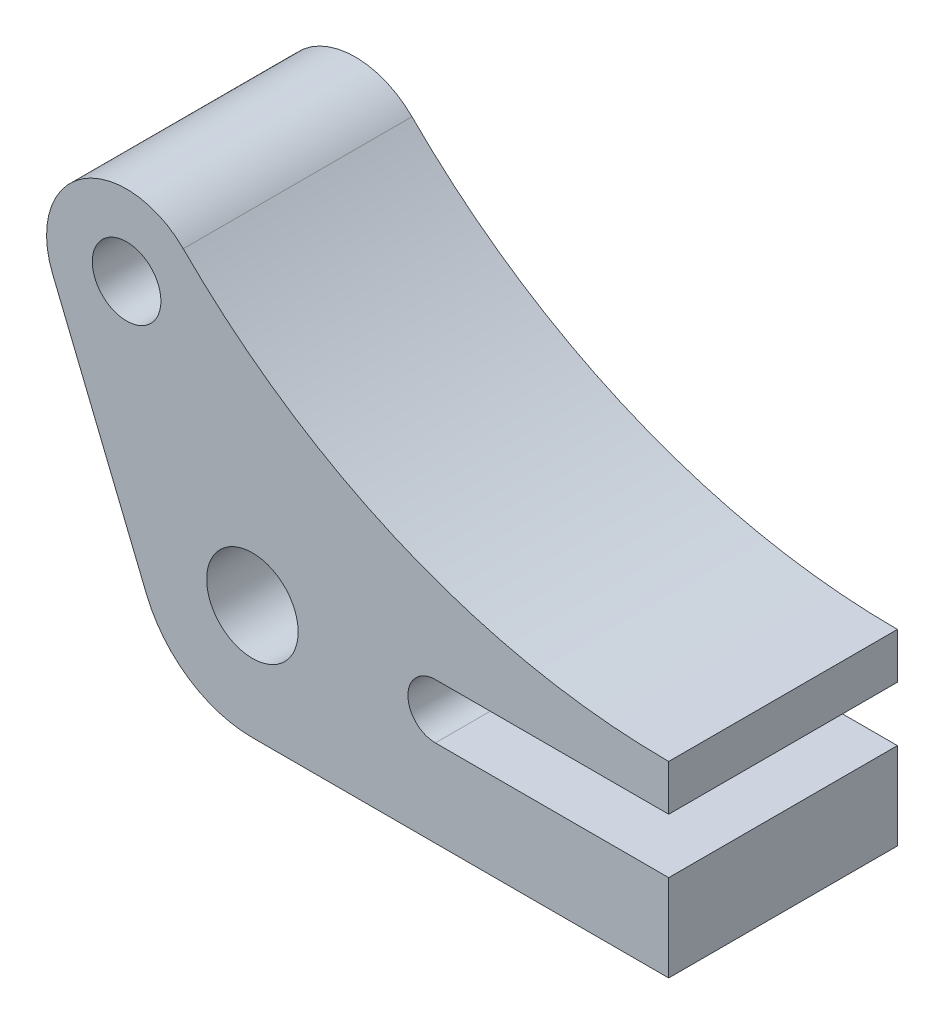
ISO-10303-21;
HEADER;
FILE_DESCRIPTION(('STEP AP214'),'2;1');
FILE_NAME('part.step','',(''),(''),'','','');
FILE_SCHEMA(('AUTOMOTIVE_DESIGN { 1 0 10303 214 1 1 1 1 }'));
ENDSEC;
DATA;
#1=APPLICATION_CONTEXT('core data for automotive mechanical design processes');
#2=APPLICATION_PROTOCOL_DEFINITION('international standard','automotive_design',2000,#1);
#3=PRODUCT_CONTEXT('',#1,'mechanical');
#4=PRODUCT('Part','Part','',(#3));
#5=PRODUCT_RELATED_PRODUCT_CATEGORY('part','',(#4));
#6=PRODUCT_DEFINITION_FORMATION('','',#4);
#7=PRODUCT_DEFINITION_CONTEXT('part definition',#1,'design');
#8=PRODUCT_DEFINITION('design','',#6,#7);
#9=PRODUCT_DEFINITION_SHAPE('','',#8);
#10=(LENGTH_UNIT() NAMED_UNIT(*) SI_UNIT(.MILLI.,.METRE.));
#11=(NAMED_UNIT(*) PLANE_ANGLE_UNIT() SI_UNIT($,.RADIAN.));
#12=(NAMED_UNIT(*) SI_UNIT($,.STERADIAN.) SOLID_ANGLE_UNIT());
#13=UNCERTAINTY_MEASURE_WITH_UNIT(LENGTH_MEASURE(1.E-05),#10,'distance_accuracy_value','');
#14=(GEOMETRIC_REPRESENTATION_CONTEXT(3) GLOBAL_UNCERTAINTY_ASSIGNED_CONTEXT((#13)) GLOBAL_UNIT_ASSIGNED_CONTEXT((#10,
#11,#12)) REPRESENTATION_CONTEXT('',''));
#15=CARTESIAN_POINT('',(0.,0.,0.));
#16=DIRECTION('',(0.,0.,1.));
#17=DIRECTION('',(1.,0.,0.));
#18=AXIS2_PLACEMENT_3D('',#15,#16,#17);
#19=CARTESIAN_POINT('',(40.,0.,25.));
#20=DIRECTION('',(0.,0.,-1.));
#21=DIRECTION('',(-1.,0.,0.));
#22=AXIS2_PLACEMENT_3D('',#19,#20,#21);
#23=CYLINDRICAL_SURFACE('',#22,5.99999999999999);
#24=CARTESIAN_POINT('',(40.,0.,-25.));
#25=DIRECTION('',(0.,0.,1.));
#26=DIRECTION('',(1.,0.,0.));
#27=AXIS2_PLACEMENT_3D('',#24,#25,#26);
#28=CIRCLE('',#27,5.99999999999999);
#29=CARTESIAN_POINT('',(40.,5.99999999999999,-25.));
#30=VERTEX_POINT('',#29);
#31=CARTESIAN_POINT('',(40.,-5.99999999999999,-25.));
#32=VERTEX_POINT('',#31);
#33=EDGE_CURVE('E152',#30,#32,#28,.T.);
#34=ORIENTED_EDGE('',*,*,#33,.F.);
#35=DIRECTION('',(0.,0.,-1.));
#36=VECTOR('',#35,1.);
#37=CARTESIAN_POINT('',(40.,5.99999999999999,25.));
#38=LINE('',#37,#36);
#39=CARTESIAN_POINT('',(40.,5.99999999999999,25.));
#40=VERTEX_POINT('',#39);
#41=EDGE_CURVE('E11',#40,#30,#38,.T.);
#42=ORIENTED_EDGE('',*,*,#41,.F.);
#43=CARTESIAN_POINT('',(40.,0.,25.));
#44=DIRECTION('',(0.,0.,1.));
#45=DIRECTION('',(1.,0.,0.));
#46=AXIS2_PLACEMENT_3D('',#43,#44,#45);
#47=CIRCLE('',#46,5.99999999999999);
#48=CARTESIAN_POINT('',(40.,-5.99999999999999,25.));
#49=VERTEX_POINT('',#48);
#50=EDGE_CURVE('E182',#40,#49,#47,.T.);
#51=ORIENTED_EDGE('',*,*,#50,.T.);
#52=DIRECTION('',(0.,0.,-1.));
#53=VECTOR('',#52,1.);
#54=CARTESIAN_POINT('',(40.,-5.99999999999999,25.));
#55=LINE('',#54,#53);
#56=EDGE_CURVE('E54',#49,#32,#55,.T.);
#57=ORIENTED_EDGE('',*,*,#56,.T.);
#58=EDGE_LOOP('',(#34,#42,#51,#57));
#59=FACE_BOUND('',#58,.T.);
#60=ADVANCED_FACE('F38',(#59),#23,.F.);
#61=CARTESIAN_POINT('',(0.,5.99999999999999,25.));
#62=DIRECTION('',(0.,1.,0.));
#63=DIRECTION('',(-1.,0.,0.));
#64=AXIS2_PLACEMENT_3D('',#61,#62,#63);
#65=PLANE('',#64);
#66=DIRECTION('',(1.,0.,0.));
#67=VECTOR('',#66,1.);
#68=CARTESIAN_POINT('',(0.,5.99999999999999,-25.));
#69=LINE('',#68,#67);
#70=CARTESIAN_POINT('',(91.0121254264887,6.00000000000001,-25.));
#71=VERTEX_POINT('',#70);
#72=EDGE_CURVE('E154',#30,#71,#69,.T.);
#73=ORIENTED_EDGE('',*,*,#72,.T.);
#74=DIRECTION('',(0.,0.,-1.));
#75=VECTOR('',#74,1.);
#76=CARTESIAN_POINT('',(91.0121254264887,6.00000000000001,25.));
#77=LINE('',#76,#75);
#78=CARTESIAN_POINT('',(91.0121254264887,6.00000000000001,25.));
#79=VERTEX_POINT('',#78);
#80=EDGE_CURVE('E46',#79,#71,#77,.T.);
#81=ORIENTED_EDGE('',*,*,#80,.F.);
#82=DIRECTION('',(1.,0.,0.));
#83=VECTOR('',#82,1.);
#84=CARTESIAN_POINT('',(0.,5.99999999999999,25.));
#85=LINE('',#84,#83);
#86=EDGE_CURVE('E217',#40,#79,#85,.T.);
#87=ORIENTED_EDGE('',*,*,#86,.F.);
#88=ORIENTED_EDGE('',*,*,#41,.T.);
#89=EDGE_LOOP('',(#73,#81,#87,#88));
#90=FACE_BOUND('',#89,.T.);
#91=ADVANCED_FACE('F204',(#90),#65,.F.);
#92=CARTESIAN_POINT('',(91.0121254264887,0.,25.));
#93=DIRECTION('',(1.,0.,0.));
#94=DIRECTION('',(0.,0.,-1.));
#95=AXIS2_PLACEMENT_3D('',#92,#93,#94);
#96=PLANE('',#95);
#97=DIRECTION('',(0.,-1.,0.));
#98=VECTOR('',#97,1.);
#99=CARTESIAN_POINT('',(91.0121254264887,0.,-25.));
#100=LINE('',#99,#98);
#101=CARTESIAN_POINT('',(91.0121254264887,16.,-25.));
#102=VERTEX_POINT('',#101);
#103=EDGE_CURVE('E157',#102,#71,#100,.T.);
#104=ORIENTED_EDGE('',*,*,#103,.F.);
#105=DIRECTION('',(0.,0.,-1.));
#106=VECTOR('',#105,1.);
#107=CARTESIAN_POINT('',(91.0121254264887,16.,25.));
#108=LINE('',#107,#106);
#109=CARTESIAN_POINT('',(91.0121254264887,16.,25.));
#110=VERTEX_POINT('',#109);
#111=EDGE_CURVE('E194',#110,#102,#108,.T.);
#112=ORIENTED_EDGE('',*,*,#111,.F.);
#113=DIRECTION('',(0.,-1.,0.));
#114=VECTOR('',#113,1.);
#115=CARTESIAN_POINT('',(91.0121254264887,0.,25.));
#116=LINE('',#115,#114);
#117=EDGE_CURVE('E201',#110,#79,#116,.T.);
#118=ORIENTED_EDGE('',*,*,#117,.T.);
#119=ORIENTED_EDGE('',*,*,#80,.T.);
#120=EDGE_LOOP('',(#104,#112,#118,#119));
#121=FACE_BOUND('',#120,.T.);
#122=ADVANCED_FACE('F199',(#121),#96,.T.);
#123=CARTESIAN_POINT('',(91.0121254264887,166.,25.));
#124=DIRECTION('',(0.,0.,-1.));
#125=DIRECTION('',(-1.,0.,0.));
#126=AXIS2_PLACEMENT_3D('',#123,#124,#125);
#127=CYLINDRICAL_SURFACE('',#126,150.);
#128=CARTESIAN_POINT('',(91.0121254264887,166.,-25.));
#129=DIRECTION('',(0.,0.,1.));
#130=DIRECTION('',(1.,0.,0.));
#131=AXIS2_PLACEMENT_3D('',#128,#129,#130);
#132=CIRCLE('',#131,150.);
#133=CARTESIAN_POINT('',(-15.1181361494716,59.9982661565468,-25.));
#134=VERTEX_POINT('',#133);
#135=EDGE_CURVE('E160',#134,#102,#132,.T.);
#136=ORIENTED_EDGE('',*,*,#135,.F.);
#137=DIRECTION('',(0.,0.,-1.));
#138=VECTOR('',#137,1.);
#139=CARTESIAN_POINT('',(-15.1181361494716,59.9982661565468,25.));
#140=LINE('',#139,#138);
#141=CARTESIAN_POINT('',(-15.1181361494716,59.9982661565468,25.));
#142=VERTEX_POINT('',#141);
#143=EDGE_CURVE('E192',#142,#134,#140,.T.);
#144=ORIENTED_EDGE('',*,*,#143,.F.);
#145=CARTESIAN_POINT('',(91.0121254264887,166.,25.));
#146=DIRECTION('',(0.,0.,1.));
#147=DIRECTION('',(1.,0.,0.));
#148=AXIS2_PLACEMENT_3D('',#145,#146,#147);
#149=CIRCLE('',#148,150.);
#150=EDGE_CURVE('E216',#142,#110,#149,.T.);
#151=ORIENTED_EDGE('',*,*,#150,.T.);
#152=ORIENTED_EDGE('',*,*,#111,.T.);
#153=EDGE_LOOP('',(#136,#144,#151,#152));
#154=FACE_BOUND('',#153,.T.);
#155=ADVANCED_FACE('F212',(#154),#127,.F.);
#156=CARTESIAN_POINT('',(-27.5000000000002,47.631397208144,25.));
#157=DIRECTION('',(0.,0.,-1.));
#158=DIRECTION('',(-1.,0.,0.));
#159=AXIS2_PLACEMENT_3D('',#156,#157,#158);
#160=CYLINDRICAL_SURFACE('',#159,17.4999999999999);
#161=CARTESIAN_POINT('',(-27.5000000000002,47.631397208144,-25.));
#162=DIRECTION('',(0.,0.,1.));
#163=DIRECTION('',(1.,0.,0.));
#164=AXIS2_PLACEMENT_3D('',#161,#162,#163);
#165=CIRCLE('',#164,17.4999999999999);
#166=CARTESIAN_POINT('',(-43.7070571155954,41.0297837953611,-25.));
#167=VERTEX_POINT('',#166);
#168=EDGE_CURVE('E163',#134,#167,#165,.T.);
#169=ORIENTED_EDGE('',*,*,#168,.T.);
#170=DIRECTION('',(0.,0.,-1.));
#171=VECTOR('',#170,1.);
#172=CARTESIAN_POINT('',(-43.7070571155954,41.0297837953611,25.));
#173=LINE('',#172,#171);
#174=CARTESIAN_POINT('',(-43.7070571155954,41.0297837953611,25.));
#175=VERTEX_POINT('',#174);
#176=EDGE_CURVE('E189',#175,#167,#173,.T.);
#177=ORIENTED_EDGE('',*,*,#176,.F.);
#178=CARTESIAN_POINT('',(-27.5000000000002,47.631397208144,25.));
#179=DIRECTION('',(0.,0.,1.));
#180=DIRECTION('',(1.,0.,0.));
#181=AXIS2_PLACEMENT_3D('',#178,#179,#180);
#182=CIRCLE('',#181,17.4999999999999);
#183=EDGE_CURVE('E219',#142,#175,#182,.T.);
#184=ORIENTED_EDGE('',*,*,#183,.F.);
#185=ORIENTED_EDGE('',*,*,#143,.T.);
#186=EDGE_LOOP('',(#169,#177,#184,#185));
#187=FACE_BOUND('',#186,.T.);
#188=ADVANCED_FACE('F257',(#187),#160,.T.);
#189=CARTESIAN_POINT('',(-23.1529387365646,-9.43087630397553,25.));
#190=DIRECTION('',(0.926117549462583,0.377235052159021,0.));
#191=DIRECTION('',(-0.377235052159021,0.926117549462583,0.));
#192=AXIS2_PLACEMENT_3D('',#189,#190,#191);
#193=PLANE('',#192);
#194=DIRECTION('',(0.377235052159021,-0.926117549462583,0.));
#195=VECTOR('',#194,1.);
#196=CARTESIAN_POINT('',(-23.1529387365646,-9.43087630397553,-25.));
#197=LINE('',#196,#195);
#198=CARTESIAN_POINT('',(-23.1529387365646,-9.43087630397553,-25.));
#199=VERTEX_POINT('',#198);
#200=EDGE_CURVE('E165',#167,#199,#197,.T.);
#201=ORIENTED_EDGE('',*,*,#200,.T.);
#202=DIRECTION('',(0.,0.,-1.));
#203=VECTOR('',#202,1.);
#204=CARTESIAN_POINT('',(-23.1529387365646,-9.43087630397553,25.));
#205=LINE('',#204,#203);
#206=CARTESIAN_POINT('',(-23.1529387365646,-9.43087630397553,25.));
#207=VERTEX_POINT('',#206);
#208=EDGE_CURVE('E186',#207,#199,#205,.T.);
#209=ORIENTED_EDGE('',*,*,#208,.F.);
#210=DIRECTION('',(0.377235052159021,-0.926117549462583,0.));
#211=VECTOR('',#210,1.);
#212=CARTESIAN_POINT('',(-23.1529387365646,-9.43087630397553,25.));
#213=LINE('',#212,#211);
#214=EDGE_CURVE('E141',#175,#207,#213,.T.);
#215=ORIENTED_EDGE('',*,*,#214,.F.);
#216=ORIENTED_EDGE('',*,*,#176,.T.);
#217=EDGE_LOOP('',(#201,#209,#215,#216));
#218=FACE_BOUND('',#217,.T.);
#219=ADVANCED_FACE('F228',(#218),#193,.F.);
#220=CARTESIAN_POINT('',(0.,0.,25.));
#221=DIRECTION('',(0.,0.,-1.));
#222=DIRECTION('',(-1.,0.,0.));
#223=AXIS2_PLACEMENT_3D('',#220,#221,#222);
#224=CYLINDRICAL_SURFACE('',#223,25.);
#225=CARTESIAN_POINT('',(0.,0.,-25.));
#226=DIRECTION('',(0.,0.,1.));
#227=DIRECTION('',(1.,0.,0.));
#228=AXIS2_PLACEMENT_3D('',#225,#226,#227);
#229=CIRCLE('',#228,25.);
#230=CARTESIAN_POINT('',(0.,-25.,-25.));
#231=VERTEX_POINT('',#230);
#232=EDGE_CURVE('E167',#199,#231,#229,.T.);
#233=ORIENTED_EDGE('',*,*,#232,.T.);
#234=DIRECTION('',(0.,0.,-1.));
#235=VECTOR('',#234,1.);
#236=CARTESIAN_POINT('',(0.,-25.,25.));
#237=LINE('',#236,#235);
#238=CARTESIAN_POINT('',(0.,-25.,25.));
#239=VERTEX_POINT('',#238);
#240=EDGE_CURVE('E126',#239,#231,#237,.T.);
#241=ORIENTED_EDGE('',*,*,#240,.F.);
#242=CARTESIAN_POINT('',(0.,0.,25.));
#243=DIRECTION('',(0.,0.,1.));
#244=DIRECTION('',(1.,0.,0.));
#245=AXIS2_PLACEMENT_3D('',#242,#243,#244);
#246=CIRCLE('',#245,25.);
#247=EDGE_CURVE('E138',#207,#239,#246,.T.);
#248=ORIENTED_EDGE('',*,*,#247,.F.);
#249=ORIENTED_EDGE('',*,*,#208,.T.);
#250=EDGE_LOOP('',(#233,#241,#248,#249));
#251=FACE_BOUND('',#250,.T.);
#252=ADVANCED_FACE('F231',(#251),#224,.T.);
#253=CARTESIAN_POINT('',(0.,-25.,25.));
#254=DIRECTION('',(0.,-1.,0.));
#255=DIRECTION('',(0.,0.,-1.));
#256=AXIS2_PLACEMENT_3D('',#253,#254,#255);
#257=PLANE('',#256);
#258=DIRECTION('',(-1.,0.,0.));
#259=VECTOR('',#258,1.);
#260=CARTESIAN_POINT('',(0.,-25.,-25.));
#261=LINE('',#260,#259);
#262=CARTESIAN_POINT('',(91.0121254264887,-25.,-25.));
#263=VERTEX_POINT('',#262);
#264=EDGE_CURVE('E123',#263,#231,#261,.T.);
#265=ORIENTED_EDGE('',*,*,#264,.F.);
#266=DIRECTION('',(0.,0.,-1.));
#267=VECTOR('',#266,1.);
#268=CARTESIAN_POINT('',(91.0121254264887,-25.,25.));
#269=LINE('',#268,#267);
#270=CARTESIAN_POINT('',(91.0121254264887,-25.,25.));
#271=VERTEX_POINT('',#270);
#272=EDGE_CURVE('E117',#271,#263,#269,.T.);
#273=ORIENTED_EDGE('',*,*,#272,.F.);
#274=DIRECTION('',(-1.,0.,0.));
#275=VECTOR('',#274,1.);
#276=CARTESIAN_POINT('',(0.,-25.,25.));
#277=LINE('',#276,#275);
#278=EDGE_CURVE('E121',#271,#239,#277,.T.);
#279=ORIENTED_EDGE('',*,*,#278,.T.);
#280=ORIENTED_EDGE('',*,*,#240,.T.);
#281=EDGE_LOOP('',(#265,#273,#279,#280));
#282=FACE_BOUND('',#281,.T.);
#283=ADVANCED_FACE('F119',(#282),#257,.T.);
#284=CARTESIAN_POINT('',(91.0121254264887,0.,25.));
#285=DIRECTION('',(-1.,0.,0.));
#286=DIRECTION('',(0.,0.,1.));
#287=AXIS2_PLACEMENT_3D('',#284,#285,#286);
#288=PLANE('',#287);
#289=DIRECTION('',(0.,1.,0.));
#290=VECTOR('',#289,1.);
#291=CARTESIAN_POINT('',(91.0121254264887,0.,-25.));
#292=LINE('',#291,#290);
#293=CARTESIAN_POINT('',(91.0121254264887,-6.,-25.));
#294=VERTEX_POINT('',#293);
#295=EDGE_CURVE('E171',#263,#294,#292,.T.);
#296=ORIENTED_EDGE('',*,*,#295,.T.);
#297=DIRECTION('',(0.,0.,-1.));
#298=VECTOR('',#297,1.);
#299=CARTESIAN_POINT('',(91.0121254264887,-6.,25.));
#300=LINE('',#299,#298);
#301=CARTESIAN_POINT('',(91.0121254264887,-6.,25.));
#302=VERTEX_POINT('',#301);
#303=EDGE_CURVE('E86',#302,#294,#300,.T.);
#304=ORIENTED_EDGE('',*,*,#303,.F.);
#305=DIRECTION('',(0.,1.,0.));
#306=VECTOR('',#305,1.);
#307=CARTESIAN_POINT('',(91.0121254264887,0.,25.));
#308=LINE('',#307,#306);
#309=EDGE_CURVE('E128',#271,#302,#308,.T.);
#310=ORIENTED_EDGE('',*,*,#309,.F.);
#311=ORIENTED_EDGE('',*,*,#272,.T.);
#312=EDGE_LOOP('',(#296,#304,#310,#311));
#313=FACE_BOUND('',#312,.T.);
#314=ADVANCED_FACE('F129',(#313),#288,.F.);
#315=CARTESIAN_POINT('',(-27.5000000000002,47.631397208144,25.));
#316=DIRECTION('',(0.,0.,-1.));
#317=DIRECTION('',(-1.,0.,0.));
#318=AXIS2_PLACEMENT_3D('',#315,#316,#317);
#319=CYLINDRICAL_SURFACE('',#318,7.5);
#320=CARTESIAN_POINT('',(-27.5000000000002,47.631397208144,25.));
#321=DIRECTION('',(0.,0.,1.));
#322=DIRECTION('',(1.,0.,0.));
#323=AXIS2_PLACEMENT_3D('',#320,#321,#322);
#324=CIRCLE('',#323,7.5);
#325=CARTESIAN_POINT('',(-20.0000000000002,47.631397208144,25.));
#326=VERTEX_POINT('',#325);
#327=EDGE_CURVE('E146',#326,#326,#324,.T.);
#328=ORIENTED_EDGE('',*,*,#327,.T.);
#329=EDGE_LOOP('',(#328));
#330=FACE_BOUND('',#329,.T.);
#331=CARTESIAN_POINT('',(-27.5000000000002,47.631397208144,-25.));
#332=DIRECTION('',(0.,0.,1.));
#333=DIRECTION('',(1.,0.,0.));
#334=AXIS2_PLACEMENT_3D('',#331,#332,#333);
#335=CIRCLE('',#334,7.5);
#336=CARTESIAN_POINT('',(-20.0000000000002,47.631397208144,-25.));
#337=VERTEX_POINT('',#336);
#338=EDGE_CURVE('E176',#337,#337,#335,.T.);
#339=ORIENTED_EDGE('',*,*,#338,.F.);
#340=EDGE_LOOP('',(#339));
#341=FACE_BOUND('',#340,.T.);
#342=ADVANCED_FACE('F235',(#330,#341),#319,.F.);
#343=CARTESIAN_POINT('',(0.,-5.99999999999999,25.));
#344=DIRECTION('',(0.,1.,0.));
#345=DIRECTION('',(-1.,0.,0.));
#346=AXIS2_PLACEMENT_3D('',#343,#344,#345);
#347=PLANE('',#346);
#348=DIRECTION('',(1.,0.,0.));
#349=VECTOR('',#348,1.);
#350=CARTESIAN_POINT('',(0.,-5.99999999999999,-25.));
#351=LINE('',#350,#349);
#352=EDGE_CURVE('E173',#32,#294,#351,.T.);
#353=ORIENTED_EDGE('',*,*,#352,.F.);
#354=ORIENTED_EDGE('',*,*,#56,.F.);
#355=DIRECTION('',(1.,0.,0.));
#356=VECTOR('',#355,1.);
#357=CARTESIAN_POINT('',(0.,-5.99999999999999,25.));
#358=LINE('',#357,#356);
#359=EDGE_CURVE('E132',#49,#302,#358,.T.);
#360=ORIENTED_EDGE('',*,*,#359,.T.);
#361=ORIENTED_EDGE('',*,*,#303,.T.);
#362=EDGE_LOOP('',(#353,#354,#360,#361));
#363=FACE_BOUND('',#362,.T.);
#364=ADVANCED_FACE('F232',(#363),#347,.T.);
#365=CARTESIAN_POINT('',(0.,0.,25.));
#366=DIRECTION('',(0.,0.,-1.));
#367=DIRECTION('',(-1.,0.,0.));
#368=AXIS2_PLACEMENT_3D('',#365,#366,#367);
#369=CYLINDRICAL_SURFACE('',#368,10.);
#370=CARTESIAN_POINT('',(0.,0.,25.));
#371=DIRECTION('',(0.,0.,1.));
#372=DIRECTION('',(1.,0.,0.));
#373=AXIS2_PLACEMENT_3D('',#370,#371,#372);
#374=CIRCLE('',#373,10.);
#375=CARTESIAN_POINT('',(10.,0.,25.));
#376=VERTEX_POINT('',#375);
#377=EDGE_CURVE('E149',#376,#376,#374,.T.);
#378=ORIENTED_EDGE('',*,*,#377,.T.);
#379=EDGE_LOOP('',(#378));
#380=FACE_BOUND('',#379,.T.);
#381=CARTESIAN_POINT('',(0.,0.,-25.));
#382=DIRECTION('',(0.,0.,1.));
#383=DIRECTION('',(1.,0.,0.));
#384=AXIS2_PLACEMENT_3D('',#381,#382,#383);
#385=CIRCLE('',#384,10.);
#386=CARTESIAN_POINT('',(10.,0.,-25.));
#387=VERTEX_POINT('',#386);
#388=EDGE_CURVE('E179',#387,#387,#385,.T.);
#389=ORIENTED_EDGE('',*,*,#388,.F.);
#390=EDGE_LOOP('',(#389));
#391=FACE_BOUND('',#390,.T.);
#392=ADVANCED_FACE('F234',(#380,#391),#369,.F.);
#393=CARTESIAN_POINT('',(0.,0.,25.));
#394=DIRECTION('',(0.,0.,1.));
#395=DIRECTION('',(1.,0.,0.));
#396=AXIS2_PLACEMENT_3D('',#393,#394,#395);
#397=PLANE('',#396);
#398=ORIENTED_EDGE('',*,*,#50,.F.);
#399=ORIENTED_EDGE('',*,*,#86,.T.);
#400=ORIENTED_EDGE('',*,*,#117,.F.);
#401=ORIENTED_EDGE('',*,*,#150,.F.);
#402=ORIENTED_EDGE('',*,*,#183,.T.);
#403=ORIENTED_EDGE('',*,*,#214,.T.);
#404=ORIENTED_EDGE('',*,*,#247,.T.);
#405=ORIENTED_EDGE('',*,*,#278,.F.);
#406=ORIENTED_EDGE('',*,*,#309,.T.);
#407=ORIENTED_EDGE('',*,*,#359,.F.);
#408=EDGE_LOOP('',(#398,#399,#400,#401,#402,#403,#404,#405,#406,#407));
#409=FACE_BOUND('',#408,.T.);
#410=ORIENTED_EDGE('',*,*,#327,.F.);
#411=EDGE_LOOP('',(#410));
#412=FACE_BOUND('',#411,.T.);
#413=ORIENTED_EDGE('',*,*,#377,.F.);
#414=EDGE_LOOP('',(#413));
#415=FACE_BOUND('',#414,.T.);
#416=ADVANCED_FACE('F135',(#409,#412,#415),#397,.T.);
#417=CARTESIAN_POINT('',(0.,0.,-25.));
#418=DIRECTION('',(0.,0.,1.));
#419=DIRECTION('',(1.,0.,0.));
#420=AXIS2_PLACEMENT_3D('',#417,#418,#419);
#421=PLANE('',#420);
#422=ORIENTED_EDGE('',*,*,#33,.T.);
#423=ORIENTED_EDGE('',*,*,#352,.T.);
#424=ORIENTED_EDGE('',*,*,#295,.F.);
#425=ORIENTED_EDGE('',*,*,#264,.T.);
#426=ORIENTED_EDGE('',*,*,#232,.F.);
#427=ORIENTED_EDGE('',*,*,#200,.F.);
#428=ORIENTED_EDGE('',*,*,#168,.F.);
#429=ORIENTED_EDGE('',*,*,#135,.T.);
#430=ORIENTED_EDGE('',*,*,#103,.T.);
#431=ORIENTED_EDGE('',*,*,#72,.F.);
#432=EDGE_LOOP('',(#422,#423,#424,#425,#426,#427,#428,#429,#430,#431));
#433=FACE_BOUND('',#432,.T.);
#434=ORIENTED_EDGE('',*,*,#338,.T.);
#435=EDGE_LOOP('',(#434));
#436=FACE_BOUND('',#435,.T.);
#437=ORIENTED_EDGE('',*,*,#388,.T.);
#438=EDGE_LOOP('',(#437));
#439=FACE_BOUND('',#438,.T.);
#440=ADVANCED_FACE('F206',(#433,#436,#439),#421,.F.);
#441=CLOSED_SHELL('',(#60,#91,#122,#155,#188,#219,#252,#283,#314,#342,#364,#392,#416,#440));
#442=MANIFOLD_SOLID_BREP('B2',#441);
#443=ADVANCED_BREP_SHAPE_REPRESENTATION('',(#18,#442),#14);
#444=SHAPE_DEFINITION_REPRESENTATION(#9,#443);
ENDSEC;
END-ISO-10303-21;
